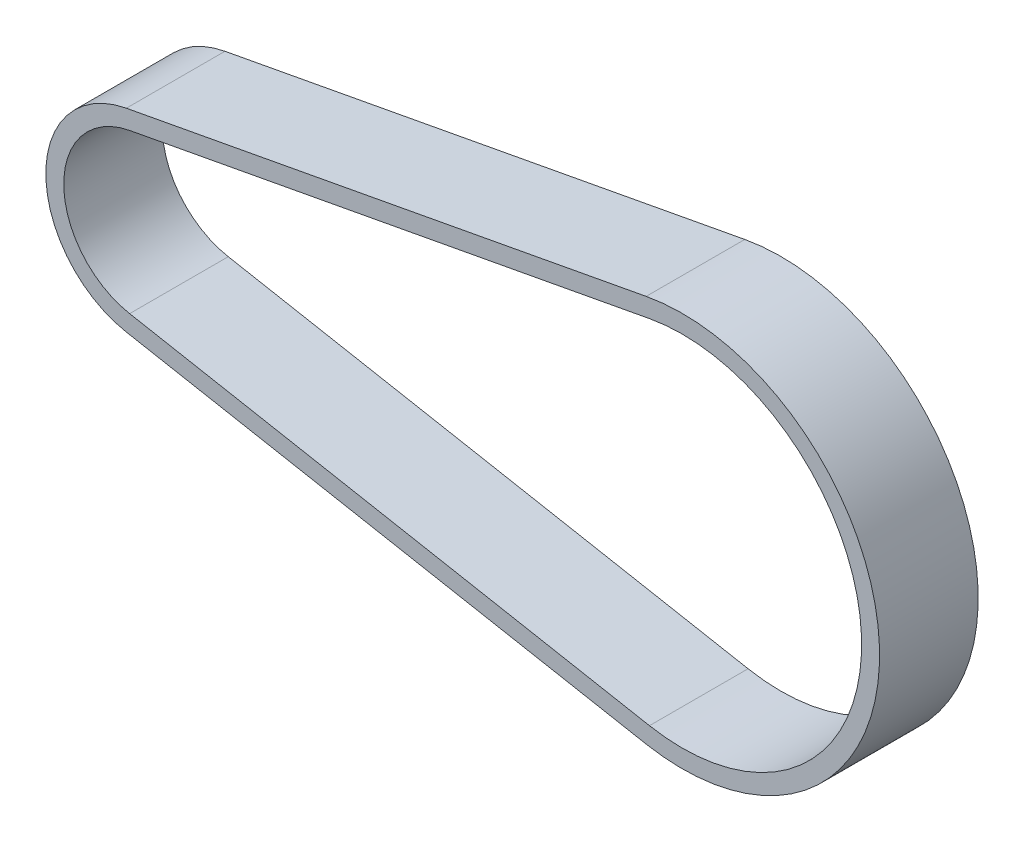
ISO-10303-21;
HEADER;
FILE_DESCRIPTION(('STEP AP214'),'2;1');
FILE_NAME('part.step','',(''),(''),'','','');
FILE_SCHEMA(('AUTOMOTIVE_DESIGN { 1 0 10303 214 1 1 1 1 }'));
ENDSEC;
DATA;
#1=APPLICATION_CONTEXT('core data for automotive mechanical design processes');
#2=APPLICATION_PROTOCOL_DEFINITION('international standard','automotive_design',2000,#1);
#3=PRODUCT_CONTEXT('',#1,'mechanical');
#4=PRODUCT('Part','Part','',(#3));
#5=PRODUCT_RELATED_PRODUCT_CATEGORY('part','',(#4));
#6=PRODUCT_DEFINITION_FORMATION('','',#4);
#7=PRODUCT_DEFINITION_CONTEXT('part definition',#1,'design');
#8=PRODUCT_DEFINITION('design','',#6,#7);
#9=PRODUCT_DEFINITION_SHAPE('','',#8);
#10=(LENGTH_UNIT() NAMED_UNIT(*) SI_UNIT(.MILLI.,.METRE.));
#11=(NAMED_UNIT(*) PLANE_ANGLE_UNIT() SI_UNIT($,.RADIAN.));
#12=(NAMED_UNIT(*) SI_UNIT($,.STERADIAN.) SOLID_ANGLE_UNIT());
#13=UNCERTAINTY_MEASURE_WITH_UNIT(LENGTH_MEASURE(1.E-05),#10,'distance_accuracy_value','');
#14=(GEOMETRIC_REPRESENTATION_CONTEXT(3) GLOBAL_UNCERTAINTY_ASSIGNED_CONTEXT((#13)) GLOBAL_UNIT_ASSIGNED_CONTEXT((#10,
#11,#12)) REPRESENTATION_CONTEXT('',''));
#15=CARTESIAN_POINT('',(0.,0.,0.));
#16=DIRECTION('',(0.,0.,1.));
#17=DIRECTION('',(1.,0.,0.));
#18=AXIS2_PLACEMENT_3D('',#15,#16,#17);
#19=CARTESIAN_POINT('',(-60.,0.,11.));
#20=DIRECTION('',(0.,0.,1.));
#21=DIRECTION('',(1.,0.,0.));
#22=AXIS2_PLACEMENT_3D('',#19,#20,#21);
#23=PLANE('',#22);
#24=CARTESIAN_POINT('',(-60.,0.,11.));
#25=DIRECTION('',(0.,0.,1.));
#26=DIRECTION('',(1.,0.,0.));
#27=AXIS2_PLACEMENT_3D('',#24,#25,#26);
#28=CIRCLE('',#27,11.);
#29=CARTESIAN_POINT('',(-62.0166666666667,10.8135588755763,11.));
#30=VERTEX_POINT('',#29);
#31=CARTESIAN_POINT('',(-62.0166666666667,-10.8135588755763,11.));
#32=VERTEX_POINT('',#31);
#33=EDGE_CURVE('E142',#30,#32,#28,.T.);
#34=ORIENTED_EDGE('',*,*,#33,.T.);
#35=DIRECTION('',(0.983050806870575,-0.183333333333333,0.));
#36=VECTOR('',#35,1.);
#37=CARTESIAN_POINT('',(-62.0166666666667,-10.8135588755763,11.));
#38=LINE('',#37,#36);
#39=CARTESIAN_POINT('',(-4.03333333333334,-21.6271177511527,11.));
#40=VERTEX_POINT('',#39);
#41=EDGE_CURVE('E145',#32,#40,#38,.T.);
#42=ORIENTED_EDGE('',*,*,#41,.T.);
#43=CARTESIAN_POINT('',(0.,0.,11.));
#44=DIRECTION('',(0.,0.,1.));
#45=DIRECTION('',(1.,0.,0.));
#46=AXIS2_PLACEMENT_3D('',#43,#44,#45);
#47=CIRCLE('',#46,22.);
#48=CARTESIAN_POINT('',(-4.03333333333333,21.6271177511527,11.));
#49=VERTEX_POINT('',#48);
#50=EDGE_CURVE('E148',#40,#49,#47,.T.);
#51=ORIENTED_EDGE('',*,*,#50,.T.);
#52=DIRECTION('',(-0.983050806870575,-0.183333333333333,0.));
#53=VECTOR('',#52,1.);
#54=CARTESIAN_POINT('',(-62.0166666666667,10.8135588755763,11.));
#55=LINE('',#54,#53);
#56=EDGE_CURVE('E150',#49,#30,#55,.T.);
#57=ORIENTED_EDGE('',*,*,#56,.T.);
#58=EDGE_LOOP('',(#34,#42,#51,#57));
#59=FACE_BOUND('',#58,.T.);
#60=DIRECTION('',(0.983050806870575,-0.183333333333333,0.));
#61=VECTOR('',#60,1.);
#62=CARTESIAN_POINT('',(-61.65,-8.84745726183518,11.));
#63=LINE('',#62,#61);
#64=CARTESIAN_POINT('',(-61.65,-8.84745726183518,11.));
#65=VERTEX_POINT('',#64);
#66=CARTESIAN_POINT('',(-3.66666666666667,-19.6610161374115,11.));
#67=VERTEX_POINT('',#66);
#68=EDGE_CURVE('E114',#65,#67,#63,.T.);
#69=ORIENTED_EDGE('',*,*,#68,.F.);
#70=CARTESIAN_POINT('',(-60.,0.,11.));
#71=DIRECTION('',(0.,0.,1.));
#72=DIRECTION('',(1.,0.,0.));
#73=AXIS2_PLACEMENT_3D('',#70,#71,#72);
#74=CIRCLE('',#73,9.00000000000001);
#75=CARTESIAN_POINT('',(-61.65,8.84745726183518,11.));
#76=VERTEX_POINT('',#75);
#77=EDGE_CURVE('E106',#76,#65,#74,.T.);
#78=ORIENTED_EDGE('',*,*,#77,.F.);
#79=DIRECTION('',(-0.983050806870575,-0.183333333333333,0.));
#80=VECTOR('',#79,1.);
#81=CARTESIAN_POINT('',(-61.65,8.84745726183518,11.));
#82=LINE('',#81,#80);
#83=CARTESIAN_POINT('',(-3.66666666666666,19.6610161374115,11.));
#84=VERTEX_POINT('',#83);
#85=EDGE_CURVE('E128',#84,#76,#82,.T.);
#86=ORIENTED_EDGE('',*,*,#85,.F.);
#87=CARTESIAN_POINT('',(0.,0.,11.));
#88=DIRECTION('',(0.,0.,1.));
#89=DIRECTION('',(1.,0.,0.));
#90=AXIS2_PLACEMENT_3D('',#87,#88,#89);
#91=CIRCLE('',#90,20.);
#92=EDGE_CURVE('E126',#67,#84,#91,.T.);
#93=ORIENTED_EDGE('',*,*,#92,.F.);
#94=EDGE_LOOP('',(#69,#78,#86,#93));
#95=FACE_BOUND('',#94,.T.);
#96=ADVANCED_FACE('F41',(#59,#95),#23,.T.);
#97=CARTESIAN_POINT('',(-60.,0.,0.));
#98=DIRECTION('',(0.,0.,1.));
#99=DIRECTION('',(1.,0.,0.));
#100=AXIS2_PLACEMENT_3D('',#97,#98,#99);
#101=PLANE('',#100);
#102=CARTESIAN_POINT('',(-60.,0.,0.));
#103=DIRECTION('',(0.,0.,1.));
#104=DIRECTION('',(1.,0.,0.));
#105=AXIS2_PLACEMENT_3D('',#102,#103,#104);
#106=CIRCLE('',#105,11.);
#107=CARTESIAN_POINT('',(-62.0166666666667,10.8135588755763,0.));
#108=VERTEX_POINT('',#107);
#109=CARTESIAN_POINT('',(-62.0166666666667,-10.8135588755763,0.));
#110=VERTEX_POINT('',#109);
#111=EDGE_CURVE('E122',#108,#110,#106,.T.);
#112=ORIENTED_EDGE('',*,*,#111,.F.);
#113=DIRECTION('',(-0.983050806870575,-0.183333333333333,0.));
#114=VECTOR('',#113,1.);
#115=CARTESIAN_POINT('',(-62.0166666666667,10.8135588755763,0.));
#116=LINE('',#115,#114);
#117=CARTESIAN_POINT('',(-4.03333333333333,21.6271177511527,0.));
#118=VERTEX_POINT('',#117);
#119=EDGE_CURVE('E146',#118,#108,#116,.T.);
#120=ORIENTED_EDGE('',*,*,#119,.F.);
#121=CARTESIAN_POINT('',(0.,0.,0.));
#122=DIRECTION('',(0.,0.,1.));
#123=DIRECTION('',(1.,0.,0.));
#124=AXIS2_PLACEMENT_3D('',#121,#122,#123);
#125=CIRCLE('',#124,22.);
#126=CARTESIAN_POINT('',(-4.03333333333334,-21.6271177511527,0.));
#127=VERTEX_POINT('',#126);
#128=EDGE_CURVE('E157',#127,#118,#125,.T.);
#129=ORIENTED_EDGE('',*,*,#128,.F.);
#130=DIRECTION('',(0.983050806870575,-0.183333333333333,0.));
#131=VECTOR('',#130,1.);
#132=CARTESIAN_POINT('',(-62.0166666666667,-10.8135588755763,0.));
#133=LINE('',#132,#131);
#134=EDGE_CURVE('E155',#110,#127,#133,.T.);
#135=ORIENTED_EDGE('',*,*,#134,.F.);
#136=EDGE_LOOP('',(#112,#120,#129,#135));
#137=FACE_BOUND('',#136,.T.);
#138=CARTESIAN_POINT('',(-60.,0.,0.));
#139=DIRECTION('',(0.,0.,1.));
#140=DIRECTION('',(1.,0.,0.));
#141=AXIS2_PLACEMENT_3D('',#138,#139,#140);
#142=CIRCLE('',#141,9.00000000000001);
#143=CARTESIAN_POINT('',(-61.65,8.84745726183518,0.));
#144=VERTEX_POINT('',#143);
#145=CARTESIAN_POINT('',(-61.65,-8.84745726183518,0.));
#146=VERTEX_POINT('',#145);
#147=EDGE_CURVE('E64',#144,#146,#142,.T.);
#148=ORIENTED_EDGE('',*,*,#147,.T.);
#149=DIRECTION('',(0.983050806870575,-0.183333333333333,0.));
#150=VECTOR('',#149,1.);
#151=CARTESIAN_POINT('',(-61.65,-8.84745726183518,0.));
#152=LINE('',#151,#150);
#153=CARTESIAN_POINT('',(-3.66666666666667,-19.6610161374115,0.));
#154=VERTEX_POINT('',#153);
#155=EDGE_CURVE('E121',#146,#154,#152,.T.);
#156=ORIENTED_EDGE('',*,*,#155,.T.);
#157=CARTESIAN_POINT('',(0.,0.,0.));
#158=DIRECTION('',(0.,0.,1.));
#159=DIRECTION('',(1.,0.,0.));
#160=AXIS2_PLACEMENT_3D('',#157,#158,#159);
#161=CIRCLE('',#160,20.);
#162=CARTESIAN_POINT('',(-3.66666666666666,19.6610161374115,0.));
#163=VERTEX_POINT('',#162);
#164=EDGE_CURVE('E134',#154,#163,#161,.T.);
#165=ORIENTED_EDGE('',*,*,#164,.T.);
#166=DIRECTION('',(-0.983050806870575,-0.183333333333333,0.));
#167=VECTOR('',#166,1.);
#168=CARTESIAN_POINT('',(-61.65,8.84745726183518,0.));
#169=LINE('',#168,#167);
#170=EDGE_CURVE('E115',#163,#144,#169,.T.);
#171=ORIENTED_EDGE('',*,*,#170,.T.);
#172=EDGE_LOOP('',(#148,#156,#165,#171));
#173=FACE_BOUND('',#172,.T.);
#174=ADVANCED_FACE('F175',(#137,#173),#101,.F.);
#175=CARTESIAN_POINT('',(-60.,0.,11.));
#176=DIRECTION('',(0.,0.,-1.));
#177=DIRECTION('',(-1.,0.,0.));
#178=AXIS2_PLACEMENT_3D('',#175,#176,#177);
#179=CYLINDRICAL_SURFACE('',#178,11.);
#180=ORIENTED_EDGE('',*,*,#111,.T.);
#181=DIRECTION('',(0.,0.,-1.));
#182=VECTOR('',#181,1.);
#183=CARTESIAN_POINT('',(-62.0166666666667,-10.8135588755763,11.));
#184=LINE('',#183,#182);
#185=EDGE_CURVE('E11',#32,#110,#184,.T.);
#186=ORIENTED_EDGE('',*,*,#185,.F.);
#187=ORIENTED_EDGE('',*,*,#33,.F.);
#188=DIRECTION('',(0.,0.,-1.));
#189=VECTOR('',#188,1.);
#190=CARTESIAN_POINT('',(-62.0166666666667,10.8135588755763,11.));
#191=LINE('',#190,#189);
#192=EDGE_CURVE('E152',#30,#108,#191,.T.);
#193=ORIENTED_EDGE('',*,*,#192,.T.);
#194=EDGE_LOOP('',(#180,#186,#187,#193));
#195=FACE_BOUND('',#194,.T.);
#196=ADVANCED_FACE('F43',(#195),#179,.T.);
#197=CARTESIAN_POINT('',(-62.0166666666667,-10.8135588755763,11.));
#198=DIRECTION('',(0.183333333333333,0.983050806870575,0.));
#199=DIRECTION('',(-0.983050806870575,0.183333333333333,0.));
#200=AXIS2_PLACEMENT_3D('',#197,#198,#199);
#201=PLANE('',#200);
#202=ORIENTED_EDGE('',*,*,#134,.T.);
#203=DIRECTION('',(0.,0.,-1.));
#204=VECTOR('',#203,1.);
#205=CARTESIAN_POINT('',(-4.03333333333334,-21.6271177511527,11.));
#206=LINE('',#205,#204);
#207=EDGE_CURVE('E49',#40,#127,#206,.T.);
#208=ORIENTED_EDGE('',*,*,#207,.F.);
#209=ORIENTED_EDGE('',*,*,#41,.F.);
#210=ORIENTED_EDGE('',*,*,#185,.T.);
#211=EDGE_LOOP('',(#202,#208,#209,#210));
#212=FACE_BOUND('',#211,.T.);
#213=ADVANCED_FACE('F185',(#212),#201,.F.);
#214=CARTESIAN_POINT('',(0.,0.,11.));
#215=DIRECTION('',(0.,0.,-1.));
#216=DIRECTION('',(-1.,0.,0.));
#217=AXIS2_PLACEMENT_3D('',#214,#215,#216);
#218=CYLINDRICAL_SURFACE('',#217,22.);
#219=ORIENTED_EDGE('',*,*,#128,.T.);
#220=DIRECTION('',(0.,0.,-1.));
#221=VECTOR('',#220,1.);
#222=CARTESIAN_POINT('',(-4.03333333333333,21.6271177511527,11.));
#223=LINE('',#222,#221);
#224=EDGE_CURVE('E162',#49,#118,#223,.T.);
#225=ORIENTED_EDGE('',*,*,#224,.F.);
#226=ORIENTED_EDGE('',*,*,#50,.F.);
#227=ORIENTED_EDGE('',*,*,#207,.T.);
#228=EDGE_LOOP('',(#219,#225,#226,#227));
#229=FACE_BOUND('',#228,.T.);
#230=ADVANCED_FACE('F169',(#229),#218,.T.);
#231=CARTESIAN_POINT('',(-62.0166666666667,10.8135588755763,11.));
#232=DIRECTION('',(0.183333333333333,-0.983050806870575,0.));
#233=DIRECTION('',(0.983050806870575,0.183333333333333,0.));
#234=AXIS2_PLACEMENT_3D('',#231,#232,#233);
#235=PLANE('',#234);
#236=ORIENTED_EDGE('',*,*,#119,.T.);
#237=ORIENTED_EDGE('',*,*,#192,.F.);
#238=ORIENTED_EDGE('',*,*,#56,.F.);
#239=ORIENTED_EDGE('',*,*,#224,.T.);
#240=EDGE_LOOP('',(#236,#237,#238,#239));
#241=FACE_BOUND('',#240,.T.);
#242=ADVANCED_FACE('F179',(#241),#235,.F.);
#243=CARTESIAN_POINT('',(-60.,0.,11.));
#244=DIRECTION('',(0.,0.,-1.));
#245=DIRECTION('',(-1.,0.,0.));
#246=AXIS2_PLACEMENT_3D('',#243,#244,#245);
#247=CYLINDRICAL_SURFACE('',#246,9.00000000000001);
#248=ORIENTED_EDGE('',*,*,#147,.F.);
#249=DIRECTION('',(0.,0.,-1.));
#250=VECTOR('',#249,1.);
#251=CARTESIAN_POINT('',(-61.65,8.84745726183518,11.));
#252=LINE('',#251,#250);
#253=EDGE_CURVE('E110',#76,#144,#252,.T.);
#254=ORIENTED_EDGE('',*,*,#253,.F.);
#255=ORIENTED_EDGE('',*,*,#77,.T.);
#256=DIRECTION('',(0.,0.,-1.));
#257=VECTOR('',#256,1.);
#258=CARTESIAN_POINT('',(-61.65,-8.84745726183518,11.));
#259=LINE('',#258,#257);
#260=EDGE_CURVE('E109',#65,#146,#259,.T.);
#261=ORIENTED_EDGE('',*,*,#260,.T.);
#262=EDGE_LOOP('',(#248,#254,#255,#261));
#263=FACE_BOUND('',#262,.T.);
#264=ADVANCED_FACE('F108',(#263),#247,.F.);
#265=CARTESIAN_POINT('',(-61.65,-8.84745726183518,11.));
#266=DIRECTION('',(0.183333333333333,0.983050806870575,0.));
#267=DIRECTION('',(-0.983050806870575,0.183333333333333,0.));
#268=AXIS2_PLACEMENT_3D('',#265,#266,#267);
#269=PLANE('',#268);
#270=ORIENTED_EDGE('',*,*,#155,.F.);
#271=ORIENTED_EDGE('',*,*,#260,.F.);
#272=ORIENTED_EDGE('',*,*,#68,.T.);
#273=DIRECTION('',(0.,0.,-1.));
#274=VECTOR('',#273,1.);
#275=CARTESIAN_POINT('',(-3.66666666666667,-19.6610161374115,11.));
#276=LINE('',#275,#274);
#277=EDGE_CURVE('E123',#67,#154,#276,.T.);
#278=ORIENTED_EDGE('',*,*,#277,.T.);
#279=EDGE_LOOP('',(#270,#271,#272,#278));
#280=FACE_BOUND('',#279,.T.);
#281=ADVANCED_FACE('F118',(#280),#269,.T.);
#282=CARTESIAN_POINT('',(0.,0.,11.));
#283=DIRECTION('',(0.,0.,-1.));
#284=DIRECTION('',(-1.,0.,0.));
#285=AXIS2_PLACEMENT_3D('',#282,#283,#284);
#286=CYLINDRICAL_SURFACE('',#285,20.);
#287=ORIENTED_EDGE('',*,*,#164,.F.);
#288=ORIENTED_EDGE('',*,*,#277,.F.);
#289=ORIENTED_EDGE('',*,*,#92,.T.);
#290=DIRECTION('',(0.,0.,-1.));
#291=VECTOR('',#290,1.);
#292=CARTESIAN_POINT('',(-3.66666666666666,19.6610161374115,11.));
#293=LINE('',#292,#291);
#294=EDGE_CURVE('E56',#84,#163,#293,.T.);
#295=ORIENTED_EDGE('',*,*,#294,.T.);
#296=EDGE_LOOP('',(#287,#288,#289,#295));
#297=FACE_BOUND('',#296,.T.);
#298=ADVANCED_FACE('F208',(#297),#286,.F.);
#299=CARTESIAN_POINT('',(-61.65,8.84745726183518,11.));
#300=DIRECTION('',(0.183333333333333,-0.983050806870575,0.));
#301=DIRECTION('',(0.983050806870575,0.183333333333333,0.));
#302=AXIS2_PLACEMENT_3D('',#299,#300,#301);
#303=PLANE('',#302);
#304=ORIENTED_EDGE('',*,*,#170,.F.);
#305=ORIENTED_EDGE('',*,*,#294,.F.);
#306=ORIENTED_EDGE('',*,*,#85,.T.);
#307=ORIENTED_EDGE('',*,*,#253,.T.);
#308=EDGE_LOOP('',(#304,#305,#306,#307));
#309=FACE_BOUND('',#308,.T.);
#310=ADVANCED_FACE('F212',(#309),#303,.T.);
#311=CLOSED_SHELL('',(#96,#174,#196,#213,#230,#242,#264,#281,#298,#310));
#312=MANIFOLD_SOLID_BREP('B2',#311);
#313=ADVANCED_BREP_SHAPE_REPRESENTATION('',(#18,#312),#14);
#314=SHAPE_DEFINITION_REPRESENTATION(#9,#313);
ENDSEC;
END-ISO-10303-21;
